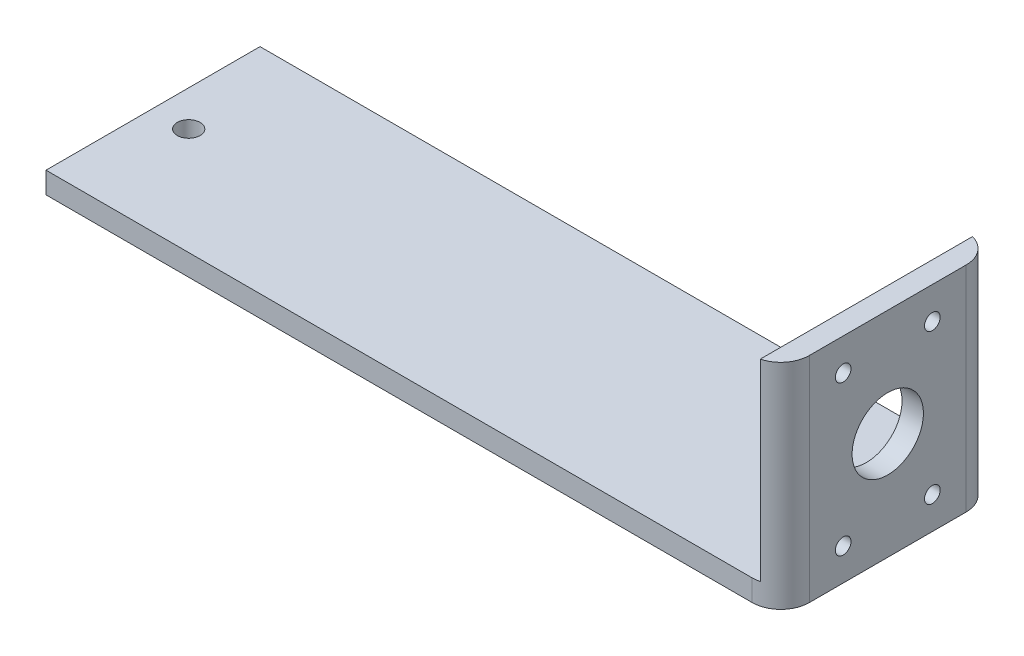
ISO-10303-21;
HEADER;
FILE_DESCRIPTION(('STEP AP214'),'2;1');
FILE_NAME('part.step','',(''),(''),'','','');
FILE_SCHEMA(('AUTOMOTIVE_DESIGN { 1 0 10303 214 1 1 1 1 }'));
ENDSEC;
DATA;
#1=APPLICATION_CONTEXT('core data for automotive mechanical design processes');
#2=APPLICATION_PROTOCOL_DEFINITION('international standard','automotive_design',2000,#1);
#3=PRODUCT_CONTEXT('',#1,'mechanical');
#4=PRODUCT('Part','Part','',(#3));
#5=PRODUCT_RELATED_PRODUCT_CATEGORY('part','',(#4));
#6=PRODUCT_DEFINITION_FORMATION('','',#4);
#7=PRODUCT_DEFINITION_CONTEXT('part definition',#1,'design');
#8=PRODUCT_DEFINITION('design','',#6,#7);
#9=PRODUCT_DEFINITION_SHAPE('','',#8);
#10=(LENGTH_UNIT() NAMED_UNIT(*) SI_UNIT(.MILLI.,.METRE.));
#11=(NAMED_UNIT(*) PLANE_ANGLE_UNIT() SI_UNIT($,.RADIAN.));
#12=(NAMED_UNIT(*) SI_UNIT($,.STERADIAN.) SOLID_ANGLE_UNIT());
#13=UNCERTAINTY_MEASURE_WITH_UNIT(LENGTH_MEASURE(1.E-05),#10,'distance_accuracy_value','');
#14=(GEOMETRIC_REPRESENTATION_CONTEXT(3) GLOBAL_UNCERTAINTY_ASSIGNED_CONTEXT((#13)) GLOBAL_UNIT_ASSIGNED_CONTEXT((#10,
#11,#12)) REPRESENTATION_CONTEXT('',''));
#15=CARTESIAN_POINT('',(0.,0.,0.));
#16=DIRECTION('',(0.,0.,1.));
#17=DIRECTION('',(1.,0.,0.));
#18=AXIS2_PLACEMENT_3D('',#15,#16,#17);
#19=CARTESIAN_POINT('',(50.,0.,0.));
#20=DIRECTION('',(-1.,0.,0.));
#21=DIRECTION('',(0.,0.,1.));
#22=AXIS2_PLACEMENT_3D('',#19,#20,#21);
#23=PLANE('',#22);
#24=CARTESIAN_POINT('',(50.,15.,0.));
#25=DIRECTION('',(-1.,0.,0.));
#26=DIRECTION('',(0.,0.,1.));
#27=AXIS2_PLACEMENT_3D('',#24,#25,#26);
#28=CIRCLE('',#27,5.);
#29=CARTESIAN_POINT('',(50.,15.,4.99999999999999));
#30=VERTEX_POINT('',#29);
#31=EDGE_CURVE('E443',#30,#30,#28,.T.);
#32=ORIENTED_EDGE('',*,*,#31,.F.);
#33=EDGE_LOOP('',(#32));
#34=FACE_BOUND('',#33,.T.);
#35=CARTESIAN_POINT('',(50.,4.5,6.25));
#36=DIRECTION('',(-1.,0.,0.));
#37=DIRECTION('',(0.,0.,1.));
#38=AXIS2_PLACEMENT_3D('',#35,#36,#37);
#39=CIRCLE('',#38,1.1);
#40=CARTESIAN_POINT('',(50.,4.5,7.34999999999999));
#41=VERTEX_POINT('',#40);
#42=EDGE_CURVE('E213',#41,#41,#39,.F.);
#43=ORIENTED_EDGE('',*,*,#42,.T.);
#44=EDGE_LOOP('',(#43));
#45=FACE_BOUND('',#44,.T.);
#46=CARTESIAN_POINT('',(50.,4.5,-6.25));
#47=DIRECTION('',(-1.,0.,0.));
#48=DIRECTION('',(0.,0.,1.));
#49=AXIS2_PLACEMENT_3D('',#46,#47,#48);
#50=CIRCLE('',#49,1.09999999999998);
#51=CARTESIAN_POINT('',(50.,4.5,-5.15000000000002));
#52=VERTEX_POINT('',#51);
#53=EDGE_CURVE('E422',#52,#52,#50,.T.);
#54=ORIENTED_EDGE('',*,*,#53,.F.);
#55=EDGE_LOOP('',(#54));
#56=FACE_BOUND('',#55,.T.);
#57=CARTESIAN_POINT('',(50.,25.5,6.25));
#58=DIRECTION('',(-1.,0.,0.));
#59=DIRECTION('',(0.,0.,1.));
#60=AXIS2_PLACEMENT_3D('',#57,#58,#59);
#61=CIRCLE('',#60,1.1);
#62=CARTESIAN_POINT('',(50.,25.5,7.35));
#63=VERTEX_POINT('',#62);
#64=EDGE_CURVE('E412',#63,#63,#61,.T.);
#65=ORIENTED_EDGE('',*,*,#64,.F.);
#66=EDGE_LOOP('',(#65));
#67=FACE_BOUND('',#66,.T.);
#68=DIRECTION('',(0.,0.,1.));
#69=VECTOR('',#68,1.);
#70=CARTESIAN_POINT('',(50.,30.,15.));
#71=LINE('',#70,#69);
#72=CARTESIAN_POINT('',(50.,30.,-14.8729833462074));
#73=VERTEX_POINT('',#72);
#74=CARTESIAN_POINT('',(50.,30.,14.8729833462074));
#75=VERTEX_POINT('',#74);
#76=EDGE_CURVE('E195',#73,#75,#71,.T.);
#77=ORIENTED_EDGE('',*,*,#76,.F.);
#78=DIRECTION('',(0.,1.,0.));
#79=VECTOR('',#78,1.);
#80=CARTESIAN_POINT('',(50.,30.,-14.8729833462074));
#81=LINE('',#80,#79);
#82=CARTESIAN_POINT('',(50.,3.,-14.8729833462074));
#83=VERTEX_POINT('',#82);
#84=EDGE_CURVE('E169',#73,#83,#81,.F.);
#85=ORIENTED_EDGE('',*,*,#84,.T.);
#86=DIRECTION('',(0.,0.,-1.));
#87=VECTOR('',#86,1.);
#88=CARTESIAN_POINT('',(50.,3.,-15.));
#89=LINE('',#88,#87);
#90=CARTESIAN_POINT('',(50.,3.,14.8729833462074));
#91=VERTEX_POINT('',#90);
#92=EDGE_CURVE('E120',#91,#83,#89,.T.);
#93=ORIENTED_EDGE('',*,*,#92,.F.);
#94=DIRECTION('',(0.,-1.,0.));
#95=VECTOR('',#94,1.);
#96=CARTESIAN_POINT('',(50.,3.,14.8729833462074));
#97=LINE('',#96,#95);
#98=EDGE_CURVE('E166',#91,#75,#97,.F.);
#99=ORIENTED_EDGE('',*,*,#98,.T.);
#100=EDGE_LOOP('',(#77,#85,#93,#99));
#101=FACE_BOUND('',#100,.T.);
#102=CARTESIAN_POINT('',(50.,25.5,-6.25));
#103=DIRECTION('',(-1.,0.,0.));
#104=DIRECTION('',(0.,0.,1.));
#105=AXIS2_PLACEMENT_3D('',#102,#103,#104);
#106=CIRCLE('',#105,1.09999999999998);
#107=CARTESIAN_POINT('',(50.,25.5,-5.15000000000002));
#108=VERTEX_POINT('',#107);
#109=EDGE_CURVE('E209',#108,#108,#106,.F.);
#110=ORIENTED_EDGE('',*,*,#109,.T.);
#111=EDGE_LOOP('',(#110));
#112=FACE_BOUND('',#111,.T.);
#113=ADVANCED_FACE('F44',(#34,#45,#56,#67,#101,#112),#23,.T.);
#114=CARTESIAN_POINT('',(53.,0.,0.));
#115=DIRECTION('',(-1.,0.,0.));
#116=DIRECTION('',(0.,0.,1.));
#117=AXIS2_PLACEMENT_3D('',#114,#115,#116);
#118=PLANE('',#117);
#119=CARTESIAN_POINT('',(53.,15.,0.));
#120=DIRECTION('',(1.,0.,0.));
#121=DIRECTION('',(0.,0.,-1.));
#122=AXIS2_PLACEMENT_3D('',#119,#120,#121);
#123=CIRCLE('',#122,5.);
#124=CARTESIAN_POINT('',(53.,15.,-5.00000000000001));
#125=VERTEX_POINT('',#124);
#126=EDGE_CURVE('E449',#125,#125,#123,.T.);
#127=ORIENTED_EDGE('',*,*,#126,.F.);
#128=EDGE_LOOP('',(#127));
#129=FACE_BOUND('',#128,.T.);
#130=CARTESIAN_POINT('',(53.,4.5,-6.25));
#131=DIRECTION('',(1.,0.,0.));
#132=DIRECTION('',(0.,0.,-1.));
#133=AXIS2_PLACEMENT_3D('',#130,#131,#132);
#134=CIRCLE('',#133,1.09999999999998);
#135=CARTESIAN_POINT('',(53.,4.5,-7.34999999999998));
#136=VERTEX_POINT('',#135);
#137=EDGE_CURVE('E440',#136,#136,#134,.T.);
#138=ORIENTED_EDGE('',*,*,#137,.F.);
#139=EDGE_LOOP('',(#138));
#140=FACE_BOUND('',#139,.T.);
#141=CARTESIAN_POINT('',(53.,25.5,6.25));
#142=DIRECTION('',(1.,0.,0.));
#143=DIRECTION('',(0.,0.,-1.));
#144=AXIS2_PLACEMENT_3D('',#141,#142,#143);
#145=CIRCLE('',#144,1.1);
#146=CARTESIAN_POINT('',(53.,25.5,5.15));
#147=VERTEX_POINT('',#146);
#148=EDGE_CURVE('E415',#147,#147,#145,.T.);
#149=ORIENTED_EDGE('',*,*,#148,.F.);
#150=EDGE_LOOP('',(#149));
#151=FACE_BOUND('',#150,.T.);
#152=DIRECTION('',(0.,0.,-1.));
#153=VECTOR('',#152,1.);
#154=CARTESIAN_POINT('',(53.,0.,15.));
#155=LINE('',#154,#153);
#156=CARTESIAN_POINT('',(53.,0.,11.));
#157=VERTEX_POINT('',#156);
#158=CARTESIAN_POINT('',(53.,0.,-11.));
#159=VERTEX_POINT('',#158);
#160=EDGE_CURVE('E184',#157,#159,#155,.T.);
#161=ORIENTED_EDGE('',*,*,#160,.T.);
#162=DIRECTION('',(0.,1.,0.));
#163=VECTOR('',#162,1.);
#164=CARTESIAN_POINT('',(53.,0.,-11.));
#165=LINE('',#164,#163);
#166=CARTESIAN_POINT('',(53.,30.,-11.));
#167=VERTEX_POINT('',#166);
#168=EDGE_CURVE('E156',#159,#167,#165,.T.);
#169=ORIENTED_EDGE('',*,*,#168,.T.);
#170=DIRECTION('',(0.,0.,1.));
#171=VECTOR('',#170,1.);
#172=CARTESIAN_POINT('',(53.,30.,15.));
#173=LINE('',#172,#171);
#174=CARTESIAN_POINT('',(53.,30.,11.));
#175=VERTEX_POINT('',#174);
#176=EDGE_CURVE('E194',#167,#175,#173,.T.);
#177=ORIENTED_EDGE('',*,*,#176,.T.);
#178=DIRECTION('',(0.,-1.,0.));
#179=VECTOR('',#178,1.);
#180=CARTESIAN_POINT('',(53.,0.,11.));
#181=LINE('',#180,#179);
#182=EDGE_CURVE('E129',#175,#157,#181,.T.);
#183=ORIENTED_EDGE('',*,*,#182,.T.);
#184=EDGE_LOOP('',(#161,#169,#177,#183));
#185=FACE_BOUND('',#184,.T.);
#186=CARTESIAN_POINT('',(53.,4.5,6.25));
#187=DIRECTION('',(-1.,0.,0.));
#188=DIRECTION('',(0.,0.,1.));
#189=AXIS2_PLACEMENT_3D('',#186,#187,#188);
#190=CIRCLE('',#189,1.1);
#191=CARTESIAN_POINT('',(53.,4.5,7.34999999999999));
#192=VERTEX_POINT('',#191);
#193=EDGE_CURVE('E425',#192,#192,#190,.T.);
#194=ORIENTED_EDGE('',*,*,#193,.T.);
#195=EDGE_LOOP('',(#194));
#196=FACE_BOUND('',#195,.T.);
#197=CARTESIAN_POINT('',(53.,25.5,-6.25));
#198=DIRECTION('',(-1.,0.,0.));
#199=DIRECTION('',(0.,0.,1.));
#200=AXIS2_PLACEMENT_3D('',#197,#198,#199);
#201=CIRCLE('',#200,1.09999999999998);
#202=CARTESIAN_POINT('',(53.,25.5,-5.15000000000002));
#203=VERTEX_POINT('',#202);
#204=EDGE_CURVE('E418',#203,#203,#201,.T.);
#205=ORIENTED_EDGE('',*,*,#204,.T.);
#206=EDGE_LOOP('',(#205));
#207=FACE_BOUND('',#206,.T.);
#208=ADVANCED_FACE('F188',(#129,#140,#151,#185,#196,#207),#118,.F.);
#209=CARTESIAN_POINT('',(-50.,3.,-15.));
#210=DIRECTION('',(0.,0.,1.));
#211=DIRECTION('',(1.,0.,0.));
#212=AXIS2_PLACEMENT_3D('',#209,#210,#211);
#213=PLANE('',#212);
#214=DIRECTION('',(-1.,0.,0.));
#215=VECTOR('',#214,1.);
#216=CARTESIAN_POINT('',(-50.,3.,-15.));
#217=LINE('',#216,#215);
#218=CARTESIAN_POINT('',(49.,3.,-15.));
#219=VERTEX_POINT('',#218);
#220=CARTESIAN_POINT('',(-50.,3.,-15.));
#221=VERTEX_POINT('',#220);
#222=EDGE_CURVE('E109',#219,#221,#217,.T.);
#223=ORIENTED_EDGE('',*,*,#222,.F.);
#224=DIRECTION('',(0.,1.,0.));
#225=VECTOR('',#224,1.);
#226=CARTESIAN_POINT('',(49.,3.,-15.));
#227=LINE('',#226,#225);
#228=CARTESIAN_POINT('',(49.,0.,-15.));
#229=VERTEX_POINT('',#228);
#230=EDGE_CURVE('E68',#219,#229,#227,.F.);
#231=ORIENTED_EDGE('',*,*,#230,.T.);
#232=DIRECTION('',(-1.,0.,0.));
#233=VECTOR('',#232,1.);
#234=CARTESIAN_POINT('',(-50.,0.,-15.));
#235=LINE('',#234,#233);
#236=CARTESIAN_POINT('',(-50.,0.,-15.));
#237=VERTEX_POINT('',#236);
#238=EDGE_CURVE('E125',#229,#237,#235,.T.);
#239=ORIENTED_EDGE('',*,*,#238,.T.);
#240=DIRECTION('',(0.,-1.,0.));
#241=VECTOR('',#240,1.);
#242=CARTESIAN_POINT('',(-50.,3.,-15.));
#243=LINE('',#242,#241);
#244=EDGE_CURVE('E123',#221,#237,#243,.T.);
#245=ORIENTED_EDGE('',*,*,#244,.F.);
#246=EDGE_LOOP('',(#223,#231,#239,#245));
#247=FACE_BOUND('',#246,.T.);
#248=ADVANCED_FACE('F124',(#247),#213,.F.);
#249=CARTESIAN_POINT('',(-50.,3.,-15.));
#250=DIRECTION('',(1.,0.,0.));
#251=DIRECTION('',(0.,0.,-1.));
#252=AXIS2_PLACEMENT_3D('',#249,#250,#251);
#253=PLANE('',#252);
#254=DIRECTION('',(0.,0.,1.));
#255=VECTOR('',#254,1.);
#256=CARTESIAN_POINT('',(-50.,0.,-15.));
#257=LINE('',#256,#255);
#258=CARTESIAN_POINT('',(-50.,0.,15.));
#259=VERTEX_POINT('',#258);
#260=EDGE_CURVE('E144',#237,#259,#257,.T.);
#261=ORIENTED_EDGE('',*,*,#260,.T.);
#262=DIRECTION('',(0.,-1.,0.));
#263=VECTOR('',#262,1.);
#264=CARTESIAN_POINT('',(-50.,3.,15.));
#265=LINE('',#264,#263);
#266=CARTESIAN_POINT('',(-50.,3.,15.));
#267=VERTEX_POINT('',#266);
#268=EDGE_CURVE('E130',#267,#259,#265,.T.);
#269=ORIENTED_EDGE('',*,*,#268,.F.);
#270=DIRECTION('',(0.,0.,1.));
#271=VECTOR('',#270,1.);
#272=CARTESIAN_POINT('',(-50.,3.,-15.));
#273=LINE('',#272,#271);
#274=EDGE_CURVE('E115',#221,#267,#273,.T.);
#275=ORIENTED_EDGE('',*,*,#274,.F.);
#276=ORIENTED_EDGE('',*,*,#244,.T.);
#277=EDGE_LOOP('',(#261,#269,#275,#276));
#278=FACE_BOUND('',#277,.T.);
#279=ADVANCED_FACE('F132',(#278),#253,.F.);
#280=CARTESIAN_POINT('',(-50.,3.,15.));
#281=DIRECTION('',(0.,0.,-1.));
#282=DIRECTION('',(-1.,0.,0.));
#283=AXIS2_PLACEMENT_3D('',#280,#281,#282);
#284=PLANE('',#283);
#285=DIRECTION('',(1.,0.,0.));
#286=VECTOR('',#285,1.);
#287=CARTESIAN_POINT('',(-50.,0.,15.));
#288=LINE('',#287,#286);
#289=CARTESIAN_POINT('',(49.,0.,15.));
#290=VERTEX_POINT('',#289);
#291=EDGE_CURVE('E148',#259,#290,#288,.T.);
#292=ORIENTED_EDGE('',*,*,#291,.T.);
#293=DIRECTION('',(0.,-1.,0.));
#294=VECTOR('',#293,1.);
#295=CARTESIAN_POINT('',(49.,3.,15.));
#296=LINE('',#295,#294);
#297=CARTESIAN_POINT('',(49.,3.,15.));
#298=VERTEX_POINT('',#297);
#299=EDGE_CURVE('E11',#290,#298,#296,.F.);
#300=ORIENTED_EDGE('',*,*,#299,.T.);
#301=DIRECTION('',(1.,0.,0.));
#302=VECTOR('',#301,1.);
#303=CARTESIAN_POINT('',(-50.,3.,15.));
#304=LINE('',#303,#302);
#305=EDGE_CURVE('E136',#267,#298,#304,.T.);
#306=ORIENTED_EDGE('',*,*,#305,.F.);
#307=ORIENTED_EDGE('',*,*,#268,.T.);
#308=EDGE_LOOP('',(#292,#300,#306,#307));
#309=FACE_BOUND('',#308,.T.);
#310=ADVANCED_FACE('F237',(#309),#284,.F.);
#311=CARTESIAN_POINT('',(0.,3.,0.));
#312=DIRECTION('',(0.,1.,0.));
#313=DIRECTION('',(0.,0.,1.));
#314=AXIS2_PLACEMENT_3D('',#311,#312,#313);
#315=PLANE('',#314);
#316=CARTESIAN_POINT('',(45.,3.,0.));
#317=DIRECTION('',(0.,1.,0.));
#318=DIRECTION('',(0.,0.,1.));
#319=AXIS2_PLACEMENT_3D('',#316,#317,#318);
#320=CIRCLE('',#319,1.6);
#321=CARTESIAN_POINT('',(45.,3.,1.6));
#322=VERTEX_POINT('',#321);
#323=EDGE_CURVE('E220',#322,#322,#320,.T.);
#324=ORIENTED_EDGE('',*,*,#323,.F.);
#325=EDGE_LOOP('',(#324));
#326=FACE_BOUND('',#325,.T.);
#327=CARTESIAN_POINT('',(-45.,3.,0.));
#328=DIRECTION('',(0.,1.,0.));
#329=DIRECTION('',(0.,0.,-1.));
#330=AXIS2_PLACEMENT_3D('',#327,#328,#329);
#331=CIRCLE('',#330,1.6);
#332=CARTESIAN_POINT('',(-45.,3.,-1.6));
#333=VERTEX_POINT('',#332);
#334=EDGE_CURVE('E224',#333,#333,#331,.T.);
#335=ORIENTED_EDGE('',*,*,#334,.F.);
#336=EDGE_LOOP('',(#335));
#337=FACE_BOUND('',#336,.T.);
#338=ORIENTED_EDGE('',*,*,#92,.T.);
#339=CARTESIAN_POINT('',(49.,3.,-11.));
#340=DIRECTION('',(0.,1.,0.));
#341=DIRECTION('',(0.,0.,1.));
#342=AXIS2_PLACEMENT_3D('',#339,#340,#341);
#343=CIRCLE('',#342,4.);
#344=EDGE_CURVE('E118',#83,#219,#343,.T.);
#345=ORIENTED_EDGE('',*,*,#344,.T.);
#346=ORIENTED_EDGE('',*,*,#222,.T.);
#347=ORIENTED_EDGE('',*,*,#274,.T.);
#348=ORIENTED_EDGE('',*,*,#305,.T.);
#349=CARTESIAN_POINT('',(49.,3.,11.));
#350=DIRECTION('',(0.,1.,0.));
#351=DIRECTION('',(0.,0.,1.));
#352=AXIS2_PLACEMENT_3D('',#349,#350,#351);
#353=CIRCLE('',#352,4.);
#354=EDGE_CURVE('E172',#298,#91,#353,.T.);
#355=ORIENTED_EDGE('',*,*,#354,.T.);
#356=EDGE_LOOP('',(#338,#345,#346,#347,#348,#355));
#357=FACE_BOUND('',#356,.T.);
#358=ADVANCED_FACE('F112',(#326,#337,#357),#315,.T.);
#359=CARTESIAN_POINT('',(0.,0.,0.));
#360=DIRECTION('',(0.,1.,0.));
#361=DIRECTION('',(0.,0.,1.));
#362=AXIS2_PLACEMENT_3D('',#359,#360,#361);
#363=PLANE('',#362);
#364=CARTESIAN_POINT('',(45.,0.,0.));
#365=DIRECTION('',(0.,1.,0.));
#366=DIRECTION('',(0.,0.,1.));
#367=AXIS2_PLACEMENT_3D('',#364,#365,#366);
#368=CIRCLE('',#367,1.6);
#369=CARTESIAN_POINT('',(45.,0.,1.6));
#370=VERTEX_POINT('',#369);
#371=EDGE_CURVE('E145',#370,#370,#368,.T.);
#372=ORIENTED_EDGE('',*,*,#371,.T.);
#373=EDGE_LOOP('',(#372));
#374=FACE_BOUND('',#373,.T.);
#375=CARTESIAN_POINT('',(-45.,0.,0.));
#376=DIRECTION('',(0.,1.,0.));
#377=DIRECTION('',(0.,0.,-1.));
#378=AXIS2_PLACEMENT_3D('',#375,#376,#377);
#379=CIRCLE('',#378,1.6);
#380=CARTESIAN_POINT('',(-45.,0.,-1.6));
#381=VERTEX_POINT('',#380);
#382=EDGE_CURVE('E228',#381,#381,#379,.T.);
#383=ORIENTED_EDGE('',*,*,#382,.T.);
#384=EDGE_LOOP('',(#383));
#385=FACE_BOUND('',#384,.T.);
#386=ORIENTED_EDGE('',*,*,#238,.F.);
#387=CARTESIAN_POINT('',(49.,0.,-11.));
#388=DIRECTION('',(0.,1.,0.));
#389=DIRECTION('',(0.,0.,1.));
#390=AXIS2_PLACEMENT_3D('',#387,#388,#389);
#391=CIRCLE('',#390,4.);
#392=EDGE_CURVE('E53',#229,#159,#391,.F.);
#393=ORIENTED_EDGE('',*,*,#392,.T.);
#394=ORIENTED_EDGE('',*,*,#160,.F.);
#395=CARTESIAN_POINT('',(49.,0.,11.));
#396=DIRECTION('',(0.,1.,0.));
#397=DIRECTION('',(0.,0.,1.));
#398=AXIS2_PLACEMENT_3D('',#395,#396,#397);
#399=CIRCLE('',#398,4.);
#400=EDGE_CURVE('E60',#157,#290,#399,.F.);
#401=ORIENTED_EDGE('',*,*,#400,.T.);
#402=ORIENTED_EDGE('',*,*,#291,.F.);
#403=ORIENTED_EDGE('',*,*,#260,.F.);
#404=EDGE_LOOP('',(#386,#393,#394,#401,#402,#403));
#405=FACE_BOUND('',#404,.T.);
#406=ADVANCED_FACE('F183',(#374,#385,#405),#363,.F.);
#407=CARTESIAN_POINT('',(-45.,0.,0.));
#408=DIRECTION('',(0.,1.,0.));
#409=DIRECTION('',(0.,0.,1.));
#410=AXIS2_PLACEMENT_3D('',#407,#408,#409);
#411=CYLINDRICAL_SURFACE('',#410,1.6);
#412=ORIENTED_EDGE('',*,*,#382,.F.);
#413=EDGE_LOOP('',(#412));
#414=FACE_BOUND('',#413,.T.);
#415=ORIENTED_EDGE('',*,*,#334,.T.);
#416=EDGE_LOOP('',(#415));
#417=FACE_BOUND('',#416,.T.);
#418=ADVANCED_FACE('F268',(#414,#417),#411,.F.);
#419=CARTESIAN_POINT('',(45.,0.,0.));
#420=DIRECTION('',(0.,1.,0.));
#421=DIRECTION('',(0.,0.,1.));
#422=AXIS2_PLACEMENT_3D('',#419,#420,#421);
#423=CYLINDRICAL_SURFACE('',#422,1.6);
#424=ORIENTED_EDGE('',*,*,#371,.F.);
#425=EDGE_LOOP('',(#424));
#426=FACE_BOUND('',#425,.T.);
#427=ORIENTED_EDGE('',*,*,#323,.T.);
#428=EDGE_LOOP('',(#427));
#429=FACE_BOUND('',#428,.T.);
#430=ADVANCED_FACE('F265',(#426,#429),#423,.F.);
#431=CARTESIAN_POINT('',(53.,30.,15.));
#432=DIRECTION('',(0.,-1.,0.));
#433=DIRECTION('',(0.,0.,-1.));
#434=AXIS2_PLACEMENT_3D('',#431,#432,#433);
#435=PLANE('',#434);
#436=ORIENTED_EDGE('',*,*,#176,.F.);
#437=CARTESIAN_POINT('',(49.,30.,-11.));
#438=DIRECTION('',(0.,-1.,0.));
#439=DIRECTION('',(0.,0.,-1.));
#440=AXIS2_PLACEMENT_3D('',#437,#438,#439);
#441=CIRCLE('',#440,4.);
#442=EDGE_CURVE('E163',#167,#73,#441,.F.);
#443=ORIENTED_EDGE('',*,*,#442,.T.);
#444=ORIENTED_EDGE('',*,*,#76,.T.);
#445=CARTESIAN_POINT('',(49.,30.,11.));
#446=DIRECTION('',(0.,-1.,0.));
#447=DIRECTION('',(0.,0.,-1.));
#448=AXIS2_PLACEMENT_3D('',#445,#446,#447);
#449=CIRCLE('',#448,4.);
#450=EDGE_CURVE('E160',#75,#175,#449,.F.);
#451=ORIENTED_EDGE('',*,*,#450,.T.);
#452=EDGE_LOOP('',(#436,#443,#444,#451));
#453=FACE_BOUND('',#452,.T.);
#454=ADVANCED_FACE('F202',(#453),#435,.F.);
#455=CARTESIAN_POINT('',(-50.,25.5,6.25000000000002));
#456=DIRECTION('',(1.,0.,0.));
#457=DIRECTION('',(0.,0.,-1.));
#458=AXIS2_PLACEMENT_3D('',#455,#456,#457);
#459=CYLINDRICAL_SURFACE('',#458,1.1);
#460=ORIENTED_EDGE('',*,*,#64,.T.);
#461=EDGE_LOOP('',(#460));
#462=FACE_BOUND('',#461,.T.);
#463=ORIENTED_EDGE('',*,*,#148,.T.);
#464=EDGE_LOOP('',(#463));
#465=FACE_BOUND('',#464,.T.);
#466=ADVANCED_FACE('F264',(#462,#465),#459,.F.);
#467=CARTESIAN_POINT('',(-50.,4.5,-6.24999999999998));
#468=DIRECTION('',(1.,0.,0.));
#469=DIRECTION('',(0.,0.,-1.));
#470=AXIS2_PLACEMENT_3D('',#467,#468,#469);
#471=CYLINDRICAL_SURFACE('',#470,1.09999999999998);
#472=ORIENTED_EDGE('',*,*,#53,.T.);
#473=EDGE_LOOP('',(#472));
#474=FACE_BOUND('',#473,.T.);
#475=ORIENTED_EDGE('',*,*,#137,.T.);
#476=EDGE_LOOP('',(#475));
#477=FACE_BOUND('',#476,.T.);
#478=ADVANCED_FACE('F332',(#474,#477),#471,.F.);
#479=CARTESIAN_POINT('',(-50.,4.5,6.25000000000002));
#480=DIRECTION('',(1.,0.,0.));
#481=DIRECTION('',(0.,0.,-1.));
#482=AXIS2_PLACEMENT_3D('',#479,#480,#481);
#483=CYLINDRICAL_SURFACE('',#482,1.1);
#484=ORIENTED_EDGE('',*,*,#42,.F.);
#485=EDGE_LOOP('',(#484));
#486=FACE_BOUND('',#485,.T.);
#487=ORIENTED_EDGE('',*,*,#193,.F.);
#488=EDGE_LOOP('',(#487));
#489=FACE_BOUND('',#488,.T.);
#490=ADVANCED_FACE('F323',(#486,#489),#483,.F.);
#491=CARTESIAN_POINT('',(-50.,25.5,-6.24999999999998));
#492=DIRECTION('',(1.,0.,0.));
#493=DIRECTION('',(0.,0.,-1.));
#494=AXIS2_PLACEMENT_3D('',#491,#492,#493);
#495=CYLINDRICAL_SURFACE('',#494,1.09999999999998);
#496=ORIENTED_EDGE('',*,*,#109,.F.);
#497=EDGE_LOOP('',(#496));
#498=FACE_BOUND('',#497,.T.);
#499=ORIENTED_EDGE('',*,*,#204,.F.);
#500=EDGE_LOOP('',(#499));
#501=FACE_BOUND('',#500,.T.);
#502=ADVANCED_FACE('F314',(#498,#501),#495,.F.);
#503=CARTESIAN_POINT('',(-50.,15.,0.));
#504=DIRECTION('',(1.,0.,0.));
#505=DIRECTION('',(0.,0.,-1.));
#506=AXIS2_PLACEMENT_3D('',#503,#504,#505);
#507=CYLINDRICAL_SURFACE('',#506,5.);
#508=ORIENTED_EDGE('',*,*,#31,.T.);
#509=EDGE_LOOP('',(#508));
#510=FACE_BOUND('',#509,.T.);
#511=ORIENTED_EDGE('',*,*,#126,.T.);
#512=EDGE_LOOP('',(#511));
#513=FACE_BOUND('',#512,.T.);
#514=ADVANCED_FACE('F299',(#510,#513),#507,.F.);
#515=CARTESIAN_POINT('',(49.,0.,-11.));
#516=DIRECTION('',(0.,1.,0.));
#517=DIRECTION('',(0.,0.,1.));
#518=AXIS2_PLACEMENT_3D('',#515,#516,#517);
#519=CYLINDRICAL_SURFACE('',#518,4.);
#520=ORIENTED_EDGE('',*,*,#392,.F.);
#521=ORIENTED_EDGE('',*,*,#230,.F.);
#522=ORIENTED_EDGE('',*,*,#344,.F.);
#523=ORIENTED_EDGE('',*,*,#84,.F.);
#524=ORIENTED_EDGE('',*,*,#442,.F.);
#525=ORIENTED_EDGE('',*,*,#168,.F.);
#526=EDGE_LOOP('',(#520,#521,#522,#523,#524,#525));
#527=FACE_BOUND('',#526,.T.);
#528=ADVANCED_FACE('F197',(#527),#519,.T.);
#529=CARTESIAN_POINT('',(49.,0.,11.));
#530=DIRECTION('',(0.,-1.,0.));
#531=DIRECTION('',(0.,0.,-1.));
#532=AXIS2_PLACEMENT_3D('',#529,#530,#531);
#533=CYLINDRICAL_SURFACE('',#532,4.);
#534=ORIENTED_EDGE('',*,*,#354,.F.);
#535=ORIENTED_EDGE('',*,*,#299,.F.);
#536=ORIENTED_EDGE('',*,*,#400,.F.);
#537=ORIENTED_EDGE('',*,*,#182,.F.);
#538=ORIENTED_EDGE('',*,*,#450,.F.);
#539=ORIENTED_EDGE('',*,*,#98,.F.);
#540=EDGE_LOOP('',(#534,#535,#536,#537,#538,#539));
#541=FACE_BOUND('',#540,.T.);
#542=ADVANCED_FACE('F46',(#541),#533,.T.);
#543=CLOSED_SHELL('',(#113,#208,#248,#279,#310,#358,#406,#418,#430,#454,#466,#478,#490,#502,
#514,#528,#542));
#544=MANIFOLD_SOLID_BREP('B2',#543);
#545=ADVANCED_BREP_SHAPE_REPRESENTATION('',(#18,#544),#14);
#546=SHAPE_DEFINITION_REPRESENTATION(#9,#545);
ENDSEC;
END-ISO-10303-21;
